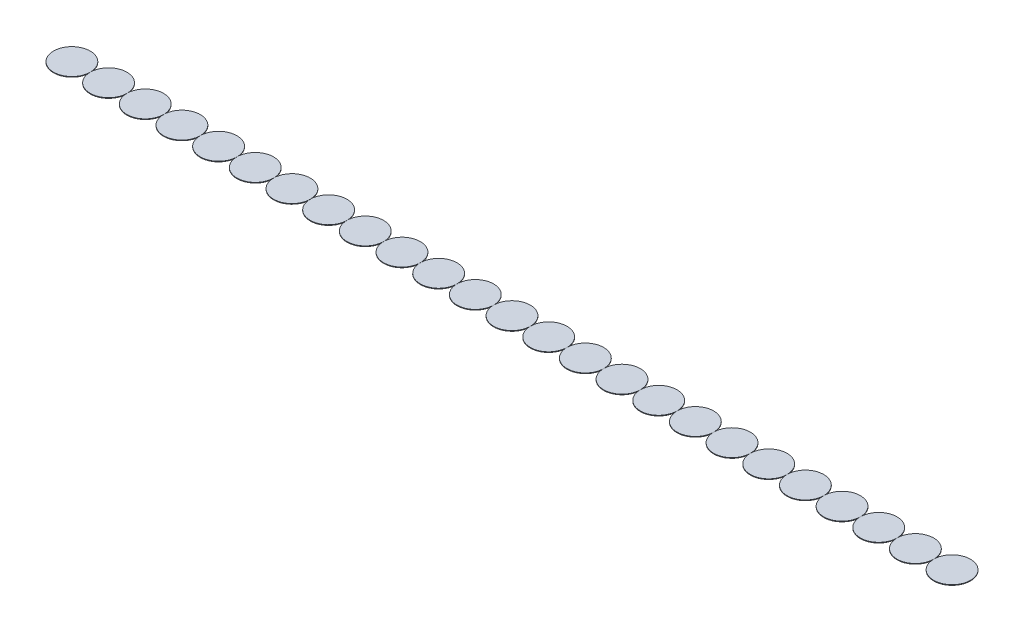
ISO-10303-21;
HEADER;
FILE_DESCRIPTION(('STEP AP214'),'2;1');
FILE_NAME('part.step','',(''),(''),'','','');
FILE_SCHEMA(('AUTOMOTIVE_DESIGN { 1 0 10303 214 1 1 1 1 }'));
ENDSEC;
DATA;
#1=APPLICATION_CONTEXT('core data for automotive mechanical design processes');
#2=APPLICATION_PROTOCOL_DEFINITION('international standard','automotive_design',2000,#1);
#3=PRODUCT_CONTEXT('',#1,'mechanical');
#4=PRODUCT('Part','Part','',(#3));
#5=PRODUCT_RELATED_PRODUCT_CATEGORY('part','',(#4));
#6=PRODUCT_DEFINITION_FORMATION('','',#4);
#7=PRODUCT_DEFINITION_CONTEXT('part definition',#1,'design');
#8=PRODUCT_DEFINITION('design','',#6,#7);
#9=PRODUCT_DEFINITION_SHAPE('','',#8);
#10=(LENGTH_UNIT() NAMED_UNIT(*) SI_UNIT(.MILLI.,.METRE.));
#11=(NAMED_UNIT(*) PLANE_ANGLE_UNIT() SI_UNIT($,.RADIAN.));
#12=(NAMED_UNIT(*) SI_UNIT($,.STERADIAN.) SOLID_ANGLE_UNIT());
#13=UNCERTAINTY_MEASURE_WITH_UNIT(LENGTH_MEASURE(1.E-05),#10,'distance_accuracy_value','');
#14=(GEOMETRIC_REPRESENTATION_CONTEXT(3) GLOBAL_UNCERTAINTY_ASSIGNED_CONTEXT((#13)) GLOBAL_UNIT_ASSIGNED_CONTEXT((#10,
#11,#12)) REPRESENTATION_CONTEXT('',''));
#15=CARTESIAN_POINT('',(0.,0.,0.));
#16=DIRECTION('',(0.,0.,1.));
#17=DIRECTION('',(1.,0.,0.));
#18=AXIS2_PLACEMENT_3D('',#15,#16,#17);
#19=CARTESIAN_POINT('',(1488.,1.,0.));
#20=DIRECTION('',(0.,-1.,0.));
#21=DIRECTION('',(0.,0.,-1.));
#22=AXIS2_PLACEMENT_3D('',#19,#20,#21);
#23=CYLINDRICAL_SURFACE('',#22,30.9999999999999);
#24=CARTESIAN_POINT('',(1488.,1.,0.));
#25=DIRECTION('',(0.,1.,0.));
#26=DIRECTION('',(0.,0.,1.));
#27=AXIS2_PLACEMENT_3D('',#24,#25,#26);
#28=CIRCLE('',#27,30.9999999999999);
#29=CARTESIAN_POINT('',(1488.,1.,30.9999999999999));
#30=VERTEX_POINT('',#29);
#31=EDGE_CURVE('E12',#30,#30,#28,.T.);
#32=ORIENTED_EDGE('',*,*,#31,.F.);
#33=EDGE_LOOP('',(#32));
#34=FACE_BOUND('',#33,.T.);
#35=CARTESIAN_POINT('',(1488.,0.,0.));
#36=DIRECTION('',(0.,1.,0.));
#37=DIRECTION('',(0.,0.,1.));
#38=AXIS2_PLACEMENT_3D('',#35,#36,#37);
#39=CIRCLE('',#38,30.9999999999999);
#40=CARTESIAN_POINT('',(1488.,0.,30.9999999999999));
#41=VERTEX_POINT('',#40);
#42=EDGE_CURVE('E147',#41,#41,#39,.T.);
#43=ORIENTED_EDGE('',*,*,#42,.T.);
#44=EDGE_LOOP('',(#43));
#45=FACE_BOUND('',#44,.T.);
#46=ADVANCED_FACE('F144',(#34,#45),#23,.T.);
#47=CARTESIAN_POINT('',(0.,1.,0.));
#48=DIRECTION('',(0.,1.,0.));
#49=DIRECTION('',(0.,0.,1.));
#50=AXIS2_PLACEMENT_3D('',#47,#48,#49);
#51=PLANE('',#50);
#52=ORIENTED_EDGE('',*,*,#31,.T.);
#53=EDGE_LOOP('',(#52));
#54=FACE_BOUND('',#53,.T.);
#55=ADVANCED_FACE('F159',(#54),#51,.T.);
#56=CARTESIAN_POINT('',(0.,0.,0.));
#57=DIRECTION('',(0.,1.,0.));
#58=DIRECTION('',(0.,0.,1.));
#59=AXIS2_PLACEMENT_3D('',#56,#57,#58);
#60=PLANE('',#59);
#61=ORIENTED_EDGE('',*,*,#42,.F.);
#62=EDGE_LOOP('',(#61));
#63=FACE_BOUND('',#62,.T.);
#64=ADVANCED_FACE('F157',(#63),#60,.F.);
#65=CLOSED_SHELL('',(#46,#55,#64));
#66=MANIFOLD_SOLID_BREP('B2',#65);
#67=CARTESIAN_POINT('',(1426.,1.,0.));
#68=DIRECTION('',(0.,-1.,0.));
#69=DIRECTION('',(0.,0.,-1.));
#70=AXIS2_PLACEMENT_3D('',#67,#68,#69);
#71=CYLINDRICAL_SURFACE('',#70,31.0000000000001);
#72=CARTESIAN_POINT('',(1426.,1.,0.));
#73=DIRECTION('',(0.,1.,0.));
#74=DIRECTION('',(0.,0.,1.));
#75=AXIS2_PLACEMENT_3D('',#72,#73,#74);
#76=CIRCLE('',#75,31.0000000000001);
#77=CARTESIAN_POINT('',(1426.,1.,31.0000000000001));
#78=VERTEX_POINT('',#77);
#79=EDGE_CURVE('E143',#78,#78,#76,.T.);
#80=ORIENTED_EDGE('',*,*,#79,.F.);
#81=EDGE_LOOP('',(#80));
#82=FACE_BOUND('',#81,.T.);
#83=CARTESIAN_POINT('',(1426.,0.,0.));
#84=DIRECTION('',(0.,1.,0.));
#85=DIRECTION('',(0.,0.,1.));
#86=AXIS2_PLACEMENT_3D('',#83,#84,#85);
#87=CIRCLE('',#86,31.0000000000001);
#88=CARTESIAN_POINT('',(1426.,0.,31.0000000000001));
#89=VERTEX_POINT('',#88);
#90=EDGE_CURVE('E196',#89,#89,#87,.T.);
#91=ORIENTED_EDGE('',*,*,#90,.T.);
#92=EDGE_LOOP('',(#91));
#93=FACE_BOUND('',#92,.T.);
#94=ADVANCED_FACE('F193',(#82,#93),#71,.T.);
#95=CARTESIAN_POINT('',(0.,1.,0.));
#96=DIRECTION('',(0.,1.,0.));
#97=DIRECTION('',(0.,0.,1.));
#98=AXIS2_PLACEMENT_3D('',#95,#96,#97);
#99=PLANE('',#98);
#100=ORIENTED_EDGE('',*,*,#79,.T.);
#101=EDGE_LOOP('',(#100));
#102=FACE_BOUND('',#101,.T.);
#103=ADVANCED_FACE('F208',(#102),#99,.T.);
#104=CARTESIAN_POINT('',(0.,0.,0.));
#105=DIRECTION('',(0.,1.,0.));
#106=DIRECTION('',(0.,0.,1.));
#107=AXIS2_PLACEMENT_3D('',#104,#105,#106);
#108=PLANE('',#107);
#109=ORIENTED_EDGE('',*,*,#90,.F.);
#110=EDGE_LOOP('',(#109));
#111=FACE_BOUND('',#110,.T.);
#112=ADVANCED_FACE('F206',(#111),#108,.F.);
#113=CLOSED_SHELL('',(#94,#103,#112));
#114=MANIFOLD_SOLID_BREP('B7',#113);
#115=CARTESIAN_POINT('',(1364.,1.,0.));
#116=DIRECTION('',(0.,-1.,0.));
#117=DIRECTION('',(0.,0.,-1.));
#118=AXIS2_PLACEMENT_3D('',#115,#116,#117);
#119=CYLINDRICAL_SURFACE('',#118,31.0000000000001);
#120=CARTESIAN_POINT('',(1364.,1.,0.));
#121=DIRECTION('',(0.,1.,0.));
#122=DIRECTION('',(0.,0.,1.));
#123=AXIS2_PLACEMENT_3D('',#120,#121,#122);
#124=CIRCLE('',#123,31.0000000000001);
#125=CARTESIAN_POINT('',(1364.,1.,31.0000000000001));
#126=VERTEX_POINT('',#125);
#127=EDGE_CURVE('E192',#126,#126,#124,.T.);
#128=ORIENTED_EDGE('',*,*,#127,.F.);
#129=EDGE_LOOP('',(#128));
#130=FACE_BOUND('',#129,.T.);
#131=CARTESIAN_POINT('',(1364.,0.,0.));
#132=DIRECTION('',(0.,1.,0.));
#133=DIRECTION('',(0.,0.,1.));
#134=AXIS2_PLACEMENT_3D('',#131,#132,#133);
#135=CIRCLE('',#134,31.0000000000001);
#136=CARTESIAN_POINT('',(1364.,0.,31.0000000000001));
#137=VERTEX_POINT('',#136);
#138=EDGE_CURVE('E245',#137,#137,#135,.T.);
#139=ORIENTED_EDGE('',*,*,#138,.T.);
#140=EDGE_LOOP('',(#139));
#141=FACE_BOUND('',#140,.T.);
#142=ADVANCED_FACE('F242',(#130,#141),#119,.T.);
#143=CARTESIAN_POINT('',(0.,1.,0.));
#144=DIRECTION('',(0.,1.,0.));
#145=DIRECTION('',(0.,0.,1.));
#146=AXIS2_PLACEMENT_3D('',#143,#144,#145);
#147=PLANE('',#146);
#148=ORIENTED_EDGE('',*,*,#127,.T.);
#149=EDGE_LOOP('',(#148));
#150=FACE_BOUND('',#149,.T.);
#151=ADVANCED_FACE('F257',(#150),#147,.T.);
#152=CARTESIAN_POINT('',(0.,0.,0.));
#153=DIRECTION('',(0.,1.,0.));
#154=DIRECTION('',(0.,0.,1.));
#155=AXIS2_PLACEMENT_3D('',#152,#153,#154);
#156=PLANE('',#155);
#157=ORIENTED_EDGE('',*,*,#138,.F.);
#158=EDGE_LOOP('',(#157));
#159=FACE_BOUND('',#158,.T.);
#160=ADVANCED_FACE('F255',(#159),#156,.F.);
#161=CLOSED_SHELL('',(#142,#151,#160));
#162=MANIFOLD_SOLID_BREP('B138',#161);
#163=CARTESIAN_POINT('',(1302.,1.,0.));
#164=DIRECTION('',(0.,-1.,0.));
#165=DIRECTION('',(0.,0.,-1.));
#166=AXIS2_PLACEMENT_3D('',#163,#164,#165);
#167=CYLINDRICAL_SURFACE('',#166,30.9999999999999);
#168=CARTESIAN_POINT('',(1302.,1.,0.));
#169=DIRECTION('',(0.,1.,0.));
#170=DIRECTION('',(0.,0.,1.));
#171=AXIS2_PLACEMENT_3D('',#168,#169,#170);
#172=CIRCLE('',#171,30.9999999999999);
#173=CARTESIAN_POINT('',(1302.,1.,30.9999999999999));
#174=VERTEX_POINT('',#173);
#175=EDGE_CURVE('E241',#174,#174,#172,.T.);
#176=ORIENTED_EDGE('',*,*,#175,.F.);
#177=EDGE_LOOP('',(#176));
#178=FACE_BOUND('',#177,.T.);
#179=CARTESIAN_POINT('',(1302.,0.,0.));
#180=DIRECTION('',(0.,1.,0.));
#181=DIRECTION('',(0.,0.,1.));
#182=AXIS2_PLACEMENT_3D('',#179,#180,#181);
#183=CIRCLE('',#182,30.9999999999999);
#184=CARTESIAN_POINT('',(1302.,0.,30.9999999999999));
#185=VERTEX_POINT('',#184);
#186=EDGE_CURVE('E294',#185,#185,#183,.T.);
#187=ORIENTED_EDGE('',*,*,#186,.T.);
#188=EDGE_LOOP('',(#187));
#189=FACE_BOUND('',#188,.T.);
#190=ADVANCED_FACE('F291',(#178,#189),#167,.T.);
#191=CARTESIAN_POINT('',(0.,1.,0.));
#192=DIRECTION('',(0.,1.,0.));
#193=DIRECTION('',(0.,0.,1.));
#194=AXIS2_PLACEMENT_3D('',#191,#192,#193);
#195=PLANE('',#194);
#196=ORIENTED_EDGE('',*,*,#175,.T.);
#197=EDGE_LOOP('',(#196));
#198=FACE_BOUND('',#197,.T.);
#199=ADVANCED_FACE('F306',(#198),#195,.T.);
#200=CARTESIAN_POINT('',(0.,0.,0.));
#201=DIRECTION('',(0.,1.,0.));
#202=DIRECTION('',(0.,0.,1.));
#203=AXIS2_PLACEMENT_3D('',#200,#201,#202);
#204=PLANE('',#203);
#205=ORIENTED_EDGE('',*,*,#186,.F.);
#206=EDGE_LOOP('',(#205));
#207=FACE_BOUND('',#206,.T.);
#208=ADVANCED_FACE('F304',(#207),#204,.F.);
#209=CLOSED_SHELL('',(#190,#199,#208));
#210=MANIFOLD_SOLID_BREP('B187',#209);
#211=CARTESIAN_POINT('',(1240.,1.,0.));
#212=DIRECTION('',(0.,-1.,0.));
#213=DIRECTION('',(0.,0.,-1.));
#214=AXIS2_PLACEMENT_3D('',#211,#212,#213);
#215=CYLINDRICAL_SURFACE('',#214,31.0000000000001);
#216=CARTESIAN_POINT('',(1240.,1.,0.));
#217=DIRECTION('',(0.,1.,0.));
#218=DIRECTION('',(0.,0.,1.));
#219=AXIS2_PLACEMENT_3D('',#216,#217,#218);
#220=CIRCLE('',#219,31.0000000000001);
#221=CARTESIAN_POINT('',(1240.,1.,31.0000000000001));
#222=VERTEX_POINT('',#221);
#223=EDGE_CURVE('E290',#222,#222,#220,.T.);
#224=ORIENTED_EDGE('',*,*,#223,.F.);
#225=EDGE_LOOP('',(#224));
#226=FACE_BOUND('',#225,.T.);
#227=CARTESIAN_POINT('',(1240.,0.,0.));
#228=DIRECTION('',(0.,1.,0.));
#229=DIRECTION('',(0.,0.,1.));
#230=AXIS2_PLACEMENT_3D('',#227,#228,#229);
#231=CIRCLE('',#230,31.0000000000001);
#232=CARTESIAN_POINT('',(1240.,0.,31.0000000000001));
#233=VERTEX_POINT('',#232);
#234=EDGE_CURVE('E343',#233,#233,#231,.T.);
#235=ORIENTED_EDGE('',*,*,#234,.T.);
#236=EDGE_LOOP('',(#235));
#237=FACE_BOUND('',#236,.T.);
#238=ADVANCED_FACE('F340',(#226,#237),#215,.T.);
#239=CARTESIAN_POINT('',(0.,1.,0.));
#240=DIRECTION('',(0.,1.,0.));
#241=DIRECTION('',(0.,0.,1.));
#242=AXIS2_PLACEMENT_3D('',#239,#240,#241);
#243=PLANE('',#242);
#244=ORIENTED_EDGE('',*,*,#223,.T.);
#245=EDGE_LOOP('',(#244));
#246=FACE_BOUND('',#245,.T.);
#247=ADVANCED_FACE('F355',(#246),#243,.T.);
#248=CARTESIAN_POINT('',(0.,0.,0.));
#249=DIRECTION('',(0.,1.,0.));
#250=DIRECTION('',(0.,0.,1.));
#251=AXIS2_PLACEMENT_3D('',#248,#249,#250);
#252=PLANE('',#251);
#253=ORIENTED_EDGE('',*,*,#234,.F.);
#254=EDGE_LOOP('',(#253));
#255=FACE_BOUND('',#254,.T.);
#256=ADVANCED_FACE('F353',(#255),#252,.F.);
#257=CLOSED_SHELL('',(#238,#247,#256));
#258=MANIFOLD_SOLID_BREP('B236',#257);
#259=CARTESIAN_POINT('',(1178.,1.,0.));
#260=DIRECTION('',(0.,-1.,0.));
#261=DIRECTION('',(0.,0.,-1.));
#262=AXIS2_PLACEMENT_3D('',#259,#260,#261);
#263=CYLINDRICAL_SURFACE('',#262,30.9999999999999);
#264=CARTESIAN_POINT('',(1178.,1.,0.));
#265=DIRECTION('',(0.,1.,0.));
#266=DIRECTION('',(0.,0.,1.));
#267=AXIS2_PLACEMENT_3D('',#264,#265,#266);
#268=CIRCLE('',#267,30.9999999999999);
#269=CARTESIAN_POINT('',(1178.,1.,30.9999999999999));
#270=VERTEX_POINT('',#269);
#271=EDGE_CURVE('E339',#270,#270,#268,.T.);
#272=ORIENTED_EDGE('',*,*,#271,.F.);
#273=EDGE_LOOP('',(#272));
#274=FACE_BOUND('',#273,.T.);
#275=CARTESIAN_POINT('',(1178.,0.,0.));
#276=DIRECTION('',(0.,1.,0.));
#277=DIRECTION('',(0.,0.,1.));
#278=AXIS2_PLACEMENT_3D('',#275,#276,#277);
#279=CIRCLE('',#278,30.9999999999999);
#280=CARTESIAN_POINT('',(1178.,0.,30.9999999999999));
#281=VERTEX_POINT('',#280);
#282=EDGE_CURVE('E392',#281,#281,#279,.T.);
#283=ORIENTED_EDGE('',*,*,#282,.T.);
#284=EDGE_LOOP('',(#283));
#285=FACE_BOUND('',#284,.T.);
#286=ADVANCED_FACE('F389',(#274,#285),#263,.T.);
#287=CARTESIAN_POINT('',(0.,1.,0.));
#288=DIRECTION('',(0.,1.,0.));
#289=DIRECTION('',(0.,0.,1.));
#290=AXIS2_PLACEMENT_3D('',#287,#288,#289);
#291=PLANE('',#290);
#292=ORIENTED_EDGE('',*,*,#271,.T.);
#293=EDGE_LOOP('',(#292));
#294=FACE_BOUND('',#293,.T.);
#295=ADVANCED_FACE('F404',(#294),#291,.T.);
#296=CARTESIAN_POINT('',(0.,0.,0.));
#297=DIRECTION('',(0.,1.,0.));
#298=DIRECTION('',(0.,0.,1.));
#299=AXIS2_PLACEMENT_3D('',#296,#297,#298);
#300=PLANE('',#299);
#301=ORIENTED_EDGE('',*,*,#282,.F.);
#302=EDGE_LOOP('',(#301));
#303=FACE_BOUND('',#302,.T.);
#304=ADVANCED_FACE('F402',(#303),#300,.F.);
#305=CLOSED_SHELL('',(#286,#295,#304));
#306=MANIFOLD_SOLID_BREP('B285',#305);
#307=CARTESIAN_POINT('',(1116.,1.,0.));
#308=DIRECTION('',(0.,-1.,0.));
#309=DIRECTION('',(0.,0.,-1.));
#310=AXIS2_PLACEMENT_3D('',#307,#308,#309);
#311=CYLINDRICAL_SURFACE('',#310,31.0000000000001);
#312=CARTESIAN_POINT('',(1116.,1.,0.));
#313=DIRECTION('',(0.,1.,0.));
#314=DIRECTION('',(0.,0.,1.));
#315=AXIS2_PLACEMENT_3D('',#312,#313,#314);
#316=CIRCLE('',#315,31.0000000000001);
#317=CARTESIAN_POINT('',(1116.,1.,31.0000000000001));
#318=VERTEX_POINT('',#317);
#319=EDGE_CURVE('E388',#318,#318,#316,.T.);
#320=ORIENTED_EDGE('',*,*,#319,.F.);
#321=EDGE_LOOP('',(#320));
#322=FACE_BOUND('',#321,.T.);
#323=CARTESIAN_POINT('',(1116.,0.,0.));
#324=DIRECTION('',(0.,1.,0.));
#325=DIRECTION('',(0.,0.,1.));
#326=AXIS2_PLACEMENT_3D('',#323,#324,#325);
#327=CIRCLE('',#326,31.0000000000001);
#328=CARTESIAN_POINT('',(1116.,0.,31.0000000000001));
#329=VERTEX_POINT('',#328);
#330=EDGE_CURVE('E441',#329,#329,#327,.T.);
#331=ORIENTED_EDGE('',*,*,#330,.T.);
#332=EDGE_LOOP('',(#331));
#333=FACE_BOUND('',#332,.T.);
#334=ADVANCED_FACE('F438',(#322,#333),#311,.T.);
#335=CARTESIAN_POINT('',(0.,1.,0.));
#336=DIRECTION('',(0.,1.,0.));
#337=DIRECTION('',(0.,0.,1.));
#338=AXIS2_PLACEMENT_3D('',#335,#336,#337);
#339=PLANE('',#338);
#340=ORIENTED_EDGE('',*,*,#319,.T.);
#341=EDGE_LOOP('',(#340));
#342=FACE_BOUND('',#341,.T.);
#343=ADVANCED_FACE('F453',(#342),#339,.T.);
#344=CARTESIAN_POINT('',(0.,0.,0.));
#345=DIRECTION('',(0.,1.,0.));
#346=DIRECTION('',(0.,0.,1.));
#347=AXIS2_PLACEMENT_3D('',#344,#345,#346);
#348=PLANE('',#347);
#349=ORIENTED_EDGE('',*,*,#330,.F.);
#350=EDGE_LOOP('',(#349));
#351=FACE_BOUND('',#350,.T.);
#352=ADVANCED_FACE('F451',(#351),#348,.F.);
#353=CLOSED_SHELL('',(#334,#343,#352));
#354=MANIFOLD_SOLID_BREP('B334',#353);
#355=CARTESIAN_POINT('',(1054.,1.,0.));
#356=DIRECTION('',(0.,-1.,0.));
#357=DIRECTION('',(0.,0.,-1.));
#358=AXIS2_PLACEMENT_3D('',#355,#356,#357);
#359=CYLINDRICAL_SURFACE('',#358,31.0000000000001);
#360=CARTESIAN_POINT('',(1054.,1.,0.));
#361=DIRECTION('',(0.,1.,0.));
#362=DIRECTION('',(0.,0.,1.));
#363=AXIS2_PLACEMENT_3D('',#360,#361,#362);
#364=CIRCLE('',#363,31.0000000000001);
#365=CARTESIAN_POINT('',(1054.,1.,31.0000000000001));
#366=VERTEX_POINT('',#365);
#367=EDGE_CURVE('E437',#366,#366,#364,.T.);
#368=ORIENTED_EDGE('',*,*,#367,.F.);
#369=EDGE_LOOP('',(#368));
#370=FACE_BOUND('',#369,.T.);
#371=CARTESIAN_POINT('',(1054.,0.,0.));
#372=DIRECTION('',(0.,1.,0.));
#373=DIRECTION('',(0.,0.,1.));
#374=AXIS2_PLACEMENT_3D('',#371,#372,#373);
#375=CIRCLE('',#374,31.0000000000001);
#376=CARTESIAN_POINT('',(1054.,0.,31.0000000000001));
#377=VERTEX_POINT('',#376);
#378=EDGE_CURVE('E490',#377,#377,#375,.T.);
#379=ORIENTED_EDGE('',*,*,#378,.T.);
#380=EDGE_LOOP('',(#379));
#381=FACE_BOUND('',#380,.T.);
#382=ADVANCED_FACE('F487',(#370,#381),#359,.T.);
#383=CARTESIAN_POINT('',(0.,1.,0.));
#384=DIRECTION('',(0.,1.,0.));
#385=DIRECTION('',(0.,0.,1.));
#386=AXIS2_PLACEMENT_3D('',#383,#384,#385);
#387=PLANE('',#386);
#388=ORIENTED_EDGE('',*,*,#367,.T.);
#389=EDGE_LOOP('',(#388));
#390=FACE_BOUND('',#389,.T.);
#391=ADVANCED_FACE('F502',(#390),#387,.T.);
#392=CARTESIAN_POINT('',(0.,0.,0.));
#393=DIRECTION('',(0.,1.,0.));
#394=DIRECTION('',(0.,0.,1.));
#395=AXIS2_PLACEMENT_3D('',#392,#393,#394);
#396=PLANE('',#395);
#397=ORIENTED_EDGE('',*,*,#378,.F.);
#398=EDGE_LOOP('',(#397));
#399=FACE_BOUND('',#398,.T.);
#400=ADVANCED_FACE('F500',(#399),#396,.F.);
#401=CLOSED_SHELL('',(#382,#391,#400));
#402=MANIFOLD_SOLID_BREP('B383',#401);
#403=CARTESIAN_POINT('',(992.,1.,0.));
#404=DIRECTION('',(0.,-1.,0.));
#405=DIRECTION('',(0.,0.,-1.));
#406=AXIS2_PLACEMENT_3D('',#403,#404,#405);
#407=CYLINDRICAL_SURFACE('',#406,30.9999999999999);
#408=CARTESIAN_POINT('',(992.,1.,0.));
#409=DIRECTION('',(0.,1.,0.));
#410=DIRECTION('',(0.,0.,1.));
#411=AXIS2_PLACEMENT_3D('',#408,#409,#410);
#412=CIRCLE('',#411,30.9999999999999);
#413=CARTESIAN_POINT('',(992.,1.,30.9999999999999));
#414=VERTEX_POINT('',#413);
#415=EDGE_CURVE('E486',#414,#414,#412,.T.);
#416=ORIENTED_EDGE('',*,*,#415,.F.);
#417=EDGE_LOOP('',(#416));
#418=FACE_BOUND('',#417,.T.);
#419=CARTESIAN_POINT('',(992.,0.,0.));
#420=DIRECTION('',(0.,1.,0.));
#421=DIRECTION('',(0.,0.,1.));
#422=AXIS2_PLACEMENT_3D('',#419,#420,#421);
#423=CIRCLE('',#422,30.9999999999999);
#424=CARTESIAN_POINT('',(992.,0.,30.9999999999999));
#425=VERTEX_POINT('',#424);
#426=EDGE_CURVE('E539',#425,#425,#423,.T.);
#427=ORIENTED_EDGE('',*,*,#426,.T.);
#428=EDGE_LOOP('',(#427));
#429=FACE_BOUND('',#428,.T.);
#430=ADVANCED_FACE('F536',(#418,#429),#407,.T.);
#431=CARTESIAN_POINT('',(0.,1.,0.));
#432=DIRECTION('',(0.,1.,0.));
#433=DIRECTION('',(0.,0.,1.));
#434=AXIS2_PLACEMENT_3D('',#431,#432,#433);
#435=PLANE('',#434);
#436=ORIENTED_EDGE('',*,*,#415,.T.);
#437=EDGE_LOOP('',(#436));
#438=FACE_BOUND('',#437,.T.);
#439=ADVANCED_FACE('F551',(#438),#435,.T.);
#440=CARTESIAN_POINT('',(0.,0.,0.));
#441=DIRECTION('',(0.,1.,0.));
#442=DIRECTION('',(0.,0.,1.));
#443=AXIS2_PLACEMENT_3D('',#440,#441,#442);
#444=PLANE('',#443);
#445=ORIENTED_EDGE('',*,*,#426,.F.);
#446=EDGE_LOOP('',(#445));
#447=FACE_BOUND('',#446,.T.);
#448=ADVANCED_FACE('F549',(#447),#444,.F.);
#449=CLOSED_SHELL('',(#430,#439,#448));
#450=MANIFOLD_SOLID_BREP('B432',#449);
#451=CARTESIAN_POINT('',(930.,1.,0.));
#452=DIRECTION('',(0.,-1.,0.));
#453=DIRECTION('',(0.,0.,-1.));
#454=AXIS2_PLACEMENT_3D('',#451,#452,#453);
#455=CYLINDRICAL_SURFACE('',#454,31.);
#456=CARTESIAN_POINT('',(930.,1.,0.));
#457=DIRECTION('',(0.,1.,0.));
#458=DIRECTION('',(0.,0.,1.));
#459=AXIS2_PLACEMENT_3D('',#456,#457,#458);
#460=CIRCLE('',#459,31.);
#461=CARTESIAN_POINT('',(930.,1.,31.));
#462=VERTEX_POINT('',#461);
#463=EDGE_CURVE('E535',#462,#462,#460,.T.);
#464=ORIENTED_EDGE('',*,*,#463,.F.);
#465=EDGE_LOOP('',(#464));
#466=FACE_BOUND('',#465,.T.);
#467=CARTESIAN_POINT('',(930.,0.,0.));
#468=DIRECTION('',(0.,1.,0.));
#469=DIRECTION('',(0.,0.,1.));
#470=AXIS2_PLACEMENT_3D('',#467,#468,#469);
#471=CIRCLE('',#470,31.);
#472=CARTESIAN_POINT('',(930.,0.,31.));
#473=VERTEX_POINT('',#472);
#474=EDGE_CURVE('E588',#473,#473,#471,.T.);
#475=ORIENTED_EDGE('',*,*,#474,.T.);
#476=EDGE_LOOP('',(#475));
#477=FACE_BOUND('',#476,.T.);
#478=ADVANCED_FACE('F585',(#466,#477),#455,.T.);
#479=CARTESIAN_POINT('',(0.,1.,0.));
#480=DIRECTION('',(0.,1.,0.));
#481=DIRECTION('',(0.,0.,1.));
#482=AXIS2_PLACEMENT_3D('',#479,#480,#481);
#483=PLANE('',#482);
#484=ORIENTED_EDGE('',*,*,#463,.T.);
#485=EDGE_LOOP('',(#484));
#486=FACE_BOUND('',#485,.T.);
#487=ADVANCED_FACE('F600',(#486),#483,.T.);
#488=CARTESIAN_POINT('',(0.,0.,0.));
#489=DIRECTION('',(0.,1.,0.));
#490=DIRECTION('',(0.,0.,1.));
#491=AXIS2_PLACEMENT_3D('',#488,#489,#490);
#492=PLANE('',#491);
#493=ORIENTED_EDGE('',*,*,#474,.F.);
#494=EDGE_LOOP('',(#493));
#495=FACE_BOUND('',#494,.T.);
#496=ADVANCED_FACE('F598',(#495),#492,.F.);
#497=CLOSED_SHELL('',(#478,#487,#496));
#498=MANIFOLD_SOLID_BREP('B481',#497);
#499=CARTESIAN_POINT('',(868.,1.,0.));
#500=DIRECTION('',(0.,-1.,0.));
#501=DIRECTION('',(0.,0.,-1.));
#502=AXIS2_PLACEMENT_3D('',#499,#500,#501);
#503=CYLINDRICAL_SURFACE('',#502,31.);
#504=CARTESIAN_POINT('',(868.,1.,0.));
#505=DIRECTION('',(0.,1.,0.));
#506=DIRECTION('',(0.,0.,1.));
#507=AXIS2_PLACEMENT_3D('',#504,#505,#506);
#508=CIRCLE('',#507,31.);
#509=CARTESIAN_POINT('',(868.,1.,31.));
#510=VERTEX_POINT('',#509);
#511=EDGE_CURVE('E584',#510,#510,#508,.T.);
#512=ORIENTED_EDGE('',*,*,#511,.F.);
#513=EDGE_LOOP('',(#512));
#514=FACE_BOUND('',#513,.T.);
#515=CARTESIAN_POINT('',(868.,0.,0.));
#516=DIRECTION('',(0.,1.,0.));
#517=DIRECTION('',(0.,0.,1.));
#518=AXIS2_PLACEMENT_3D('',#515,#516,#517);
#519=CIRCLE('',#518,31.);
#520=CARTESIAN_POINT('',(868.,0.,31.));
#521=VERTEX_POINT('',#520);
#522=EDGE_CURVE('E637',#521,#521,#519,.T.);
#523=ORIENTED_EDGE('',*,*,#522,.T.);
#524=EDGE_LOOP('',(#523));
#525=FACE_BOUND('',#524,.T.);
#526=ADVANCED_FACE('F634',(#514,#525),#503,.T.);
#527=CARTESIAN_POINT('',(0.,1.,0.));
#528=DIRECTION('',(0.,1.,0.));
#529=DIRECTION('',(0.,0.,1.));
#530=AXIS2_PLACEMENT_3D('',#527,#528,#529);
#531=PLANE('',#530);
#532=ORIENTED_EDGE('',*,*,#511,.T.);
#533=EDGE_LOOP('',(#532));
#534=FACE_BOUND('',#533,.T.);
#535=ADVANCED_FACE('F649',(#534),#531,.T.);
#536=CARTESIAN_POINT('',(0.,0.,0.));
#537=DIRECTION('',(0.,1.,0.));
#538=DIRECTION('',(0.,0.,1.));
#539=AXIS2_PLACEMENT_3D('',#536,#537,#538);
#540=PLANE('',#539);
#541=ORIENTED_EDGE('',*,*,#522,.F.);
#542=EDGE_LOOP('',(#541));
#543=FACE_BOUND('',#542,.T.);
#544=ADVANCED_FACE('F647',(#543),#540,.F.);
#545=CLOSED_SHELL('',(#526,#535,#544));
#546=MANIFOLD_SOLID_BREP('B530',#545);
#547=CARTESIAN_POINT('',(806.,1.,0.));
#548=DIRECTION('',(0.,-1.,0.));
#549=DIRECTION('',(0.,0.,-1.));
#550=AXIS2_PLACEMENT_3D('',#547,#548,#549);
#551=CYLINDRICAL_SURFACE('',#550,30.9999999999999);
#552=CARTESIAN_POINT('',(806.,1.,0.));
#553=DIRECTION('',(0.,1.,0.));
#554=DIRECTION('',(0.,0.,1.));
#555=AXIS2_PLACEMENT_3D('',#552,#553,#554);
#556=CIRCLE('',#555,30.9999999999999);
#557=CARTESIAN_POINT('',(806.,1.,30.9999999999999));
#558=VERTEX_POINT('',#557);
#559=EDGE_CURVE('E633',#558,#558,#556,.T.);
#560=ORIENTED_EDGE('',*,*,#559,.F.);
#561=EDGE_LOOP('',(#560));
#562=FACE_BOUND('',#561,.T.);
#563=CARTESIAN_POINT('',(806.,0.,0.));
#564=DIRECTION('',(0.,1.,0.));
#565=DIRECTION('',(0.,0.,1.));
#566=AXIS2_PLACEMENT_3D('',#563,#564,#565);
#567=CIRCLE('',#566,30.9999999999999);
#568=CARTESIAN_POINT('',(806.,0.,30.9999999999999));
#569=VERTEX_POINT('',#568);
#570=EDGE_CURVE('E686',#569,#569,#567,.T.);
#571=ORIENTED_EDGE('',*,*,#570,.T.);
#572=EDGE_LOOP('',(#571));
#573=FACE_BOUND('',#572,.T.);
#574=ADVANCED_FACE('F683',(#562,#573),#551,.T.);
#575=CARTESIAN_POINT('',(0.,1.,0.));
#576=DIRECTION('',(0.,1.,0.));
#577=DIRECTION('',(0.,0.,1.));
#578=AXIS2_PLACEMENT_3D('',#575,#576,#577);
#579=PLANE('',#578);
#580=ORIENTED_EDGE('',*,*,#559,.T.);
#581=EDGE_LOOP('',(#580));
#582=FACE_BOUND('',#581,.T.);
#583=ADVANCED_FACE('F698',(#582),#579,.T.);
#584=CARTESIAN_POINT('',(0.,0.,0.));
#585=DIRECTION('',(0.,1.,0.));
#586=DIRECTION('',(0.,0.,1.));
#587=AXIS2_PLACEMENT_3D('',#584,#585,#586);
#588=PLANE('',#587);
#589=ORIENTED_EDGE('',*,*,#570,.F.);
#590=EDGE_LOOP('',(#589));
#591=FACE_BOUND('',#590,.T.);
#592=ADVANCED_FACE('F696',(#591),#588,.F.);
#593=CLOSED_SHELL('',(#574,#583,#592));
#594=MANIFOLD_SOLID_BREP('B579',#593);
#595=CARTESIAN_POINT('',(744.,1.,0.));
#596=DIRECTION('',(0.,-1.,0.));
#597=DIRECTION('',(0.,0.,-1.));
#598=AXIS2_PLACEMENT_3D('',#595,#596,#597);
#599=CYLINDRICAL_SURFACE('',#598,31.);
#600=CARTESIAN_POINT('',(744.,1.,0.));
#601=DIRECTION('',(0.,1.,0.));
#602=DIRECTION('',(0.,0.,1.));
#603=AXIS2_PLACEMENT_3D('',#600,#601,#602);
#604=CIRCLE('',#603,31.);
#605=CARTESIAN_POINT('',(744.,1.,31.));
#606=VERTEX_POINT('',#605);
#607=EDGE_CURVE('E682',#606,#606,#604,.T.);
#608=ORIENTED_EDGE('',*,*,#607,.F.);
#609=EDGE_LOOP('',(#608));
#610=FACE_BOUND('',#609,.T.);
#611=CARTESIAN_POINT('',(744.,0.,0.));
#612=DIRECTION('',(0.,1.,0.));
#613=DIRECTION('',(0.,0.,1.));
#614=AXIS2_PLACEMENT_3D('',#611,#612,#613);
#615=CIRCLE('',#614,31.);
#616=CARTESIAN_POINT('',(744.,0.,31.));
#617=VERTEX_POINT('',#616);
#618=EDGE_CURVE('E735',#617,#617,#615,.T.);
#619=ORIENTED_EDGE('',*,*,#618,.T.);
#620=EDGE_LOOP('',(#619));
#621=FACE_BOUND('',#620,.T.);
#622=ADVANCED_FACE('F732',(#610,#621),#599,.T.);
#623=CARTESIAN_POINT('',(0.,1.,0.));
#624=DIRECTION('',(0.,1.,0.));
#625=DIRECTION('',(0.,0.,1.));
#626=AXIS2_PLACEMENT_3D('',#623,#624,#625);
#627=PLANE('',#626);
#628=ORIENTED_EDGE('',*,*,#607,.T.);
#629=EDGE_LOOP('',(#628));
#630=FACE_BOUND('',#629,.T.);
#631=ADVANCED_FACE('F747',(#630),#627,.T.);
#632=CARTESIAN_POINT('',(0.,0.,0.));
#633=DIRECTION('',(0.,1.,0.));
#634=DIRECTION('',(0.,0.,1.));
#635=AXIS2_PLACEMENT_3D('',#632,#633,#634);
#636=PLANE('',#635);
#637=ORIENTED_EDGE('',*,*,#618,.F.);
#638=EDGE_LOOP('',(#637));
#639=FACE_BOUND('',#638,.T.);
#640=ADVANCED_FACE('F745',(#639),#636,.F.);
#641=CLOSED_SHELL('',(#622,#631,#640));
#642=MANIFOLD_SOLID_BREP('B628',#641);
#643=CARTESIAN_POINT('',(682.,1.,0.));
#644=DIRECTION('',(0.,-1.,0.));
#645=DIRECTION('',(0.,0.,-1.));
#646=AXIS2_PLACEMENT_3D('',#643,#644,#645);
#647=CYLINDRICAL_SURFACE('',#646,31.0000000000001);
#648=CARTESIAN_POINT('',(682.,1.,0.));
#649=DIRECTION('',(0.,1.,0.));
#650=DIRECTION('',(0.,0.,1.));
#651=AXIS2_PLACEMENT_3D('',#648,#649,#650);
#652=CIRCLE('',#651,31.0000000000001);
#653=CARTESIAN_POINT('',(682.,1.,31.0000000000001));
#654=VERTEX_POINT('',#653);
#655=EDGE_CURVE('E731',#654,#654,#652,.T.);
#656=ORIENTED_EDGE('',*,*,#655,.F.);
#657=EDGE_LOOP('',(#656));
#658=FACE_BOUND('',#657,.T.);
#659=CARTESIAN_POINT('',(682.,0.,0.));
#660=DIRECTION('',(0.,1.,0.));
#661=DIRECTION('',(0.,0.,1.));
#662=AXIS2_PLACEMENT_3D('',#659,#660,#661);
#663=CIRCLE('',#662,31.0000000000001);
#664=CARTESIAN_POINT('',(682.,0.,31.0000000000001));
#665=VERTEX_POINT('',#664);
#666=EDGE_CURVE('E784',#665,#665,#663,.T.);
#667=ORIENTED_EDGE('',*,*,#666,.T.);
#668=EDGE_LOOP('',(#667));
#669=FACE_BOUND('',#668,.T.);
#670=ADVANCED_FACE('F781',(#658,#669),#647,.T.);
#671=CARTESIAN_POINT('',(0.,1.,0.));
#672=DIRECTION('',(0.,1.,0.));
#673=DIRECTION('',(0.,0.,1.));
#674=AXIS2_PLACEMENT_3D('',#671,#672,#673);
#675=PLANE('',#674);
#676=ORIENTED_EDGE('',*,*,#655,.T.);
#677=EDGE_LOOP('',(#676));
#678=FACE_BOUND('',#677,.T.);
#679=ADVANCED_FACE('F796',(#678),#675,.T.);
#680=CARTESIAN_POINT('',(0.,0.,0.));
#681=DIRECTION('',(0.,1.,0.));
#682=DIRECTION('',(0.,0.,1.));
#683=AXIS2_PLACEMENT_3D('',#680,#681,#682);
#684=PLANE('',#683);
#685=ORIENTED_EDGE('',*,*,#666,.F.);
#686=EDGE_LOOP('',(#685));
#687=FACE_BOUND('',#686,.T.);
#688=ADVANCED_FACE('F794',(#687),#684,.F.);
#689=CLOSED_SHELL('',(#670,#679,#688));
#690=MANIFOLD_SOLID_BREP('B677',#689);
#691=CARTESIAN_POINT('',(620.,1.,0.));
#692=DIRECTION('',(0.,-1.,0.));
#693=DIRECTION('',(0.,0.,-1.));
#694=AXIS2_PLACEMENT_3D('',#691,#692,#693);
#695=CYLINDRICAL_SURFACE('',#694,31.);
#696=CARTESIAN_POINT('',(620.,1.,0.));
#697=DIRECTION('',(0.,1.,0.));
#698=DIRECTION('',(0.,0.,1.));
#699=AXIS2_PLACEMENT_3D('',#696,#697,#698);
#700=CIRCLE('',#699,31.);
#701=CARTESIAN_POINT('',(620.,1.,31.));
#702=VERTEX_POINT('',#701);
#703=EDGE_CURVE('E780',#702,#702,#700,.T.);
#704=ORIENTED_EDGE('',*,*,#703,.F.);
#705=EDGE_LOOP('',(#704));
#706=FACE_BOUND('',#705,.T.);
#707=CARTESIAN_POINT('',(620.,0.,0.));
#708=DIRECTION('',(0.,1.,0.));
#709=DIRECTION('',(0.,0.,1.));
#710=AXIS2_PLACEMENT_3D('',#707,#708,#709);
#711=CIRCLE('',#710,31.);
#712=CARTESIAN_POINT('',(620.,0.,31.));
#713=VERTEX_POINT('',#712);
#714=EDGE_CURVE('E833',#713,#713,#711,.T.);
#715=ORIENTED_EDGE('',*,*,#714,.T.);
#716=EDGE_LOOP('',(#715));
#717=FACE_BOUND('',#716,.T.);
#718=ADVANCED_FACE('F830',(#706,#717),#695,.T.);
#719=CARTESIAN_POINT('',(0.,1.,0.));
#720=DIRECTION('',(0.,1.,0.));
#721=DIRECTION('',(0.,0.,1.));
#722=AXIS2_PLACEMENT_3D('',#719,#720,#721);
#723=PLANE('',#722);
#724=ORIENTED_EDGE('',*,*,#703,.T.);
#725=EDGE_LOOP('',(#724));
#726=FACE_BOUND('',#725,.T.);
#727=ADVANCED_FACE('F845',(#726),#723,.T.);
#728=CARTESIAN_POINT('',(0.,0.,0.));
#729=DIRECTION('',(0.,1.,0.));
#730=DIRECTION('',(0.,0.,1.));
#731=AXIS2_PLACEMENT_3D('',#728,#729,#730);
#732=PLANE('',#731);
#733=ORIENTED_EDGE('',*,*,#714,.F.);
#734=EDGE_LOOP('',(#733));
#735=FACE_BOUND('',#734,.T.);
#736=ADVANCED_FACE('F843',(#735),#732,.F.);
#737=CLOSED_SHELL('',(#718,#727,#736));
#738=MANIFOLD_SOLID_BREP('B726',#737);
#739=CARTESIAN_POINT('',(558.,1.,0.));
#740=DIRECTION('',(0.,-1.,0.));
#741=DIRECTION('',(0.,0.,-1.));
#742=AXIS2_PLACEMENT_3D('',#739,#740,#741);
#743=CYLINDRICAL_SURFACE('',#742,30.9999999999999);
#744=CARTESIAN_POINT('',(558.,1.,0.));
#745=DIRECTION('',(0.,1.,0.));
#746=DIRECTION('',(0.,0.,1.));
#747=AXIS2_PLACEMENT_3D('',#744,#745,#746);
#748=CIRCLE('',#747,30.9999999999999);
#749=CARTESIAN_POINT('',(558.,1.,30.9999999999999));
#750=VERTEX_POINT('',#749);
#751=EDGE_CURVE('E829',#750,#750,#748,.T.);
#752=ORIENTED_EDGE('',*,*,#751,.F.);
#753=EDGE_LOOP('',(#752));
#754=FACE_BOUND('',#753,.T.);
#755=CARTESIAN_POINT('',(558.,0.,0.));
#756=DIRECTION('',(0.,1.,0.));
#757=DIRECTION('',(0.,0.,1.));
#758=AXIS2_PLACEMENT_3D('',#755,#756,#757);
#759=CIRCLE('',#758,30.9999999999999);
#760=CARTESIAN_POINT('',(558.,0.,30.9999999999999));
#761=VERTEX_POINT('',#760);
#762=EDGE_CURVE('E882',#761,#761,#759,.T.);
#763=ORIENTED_EDGE('',*,*,#762,.T.);
#764=EDGE_LOOP('',(#763));
#765=FACE_BOUND('',#764,.T.);
#766=ADVANCED_FACE('F879',(#754,#765),#743,.T.);
#767=CARTESIAN_POINT('',(0.,1.,0.));
#768=DIRECTION('',(0.,1.,0.));
#769=DIRECTION('',(0.,0.,1.));
#770=AXIS2_PLACEMENT_3D('',#767,#768,#769);
#771=PLANE('',#770);
#772=ORIENTED_EDGE('',*,*,#751,.T.);
#773=EDGE_LOOP('',(#772));
#774=FACE_BOUND('',#773,.T.);
#775=ADVANCED_FACE('F894',(#774),#771,.T.);
#776=CARTESIAN_POINT('',(0.,0.,0.));
#777=DIRECTION('',(0.,1.,0.));
#778=DIRECTION('',(0.,0.,1.));
#779=AXIS2_PLACEMENT_3D('',#776,#777,#778);
#780=PLANE('',#779);
#781=ORIENTED_EDGE('',*,*,#762,.F.);
#782=EDGE_LOOP('',(#781));
#783=FACE_BOUND('',#782,.T.);
#784=ADVANCED_FACE('F892',(#783),#780,.F.);
#785=CLOSED_SHELL('',(#766,#775,#784));
#786=MANIFOLD_SOLID_BREP('B775',#785);
#787=CARTESIAN_POINT('',(496.,1.,0.));
#788=DIRECTION('',(0.,-1.,0.));
#789=DIRECTION('',(0.,0.,-1.));
#790=AXIS2_PLACEMENT_3D('',#787,#788,#789);
#791=CYLINDRICAL_SURFACE('',#790,31.);
#792=CARTESIAN_POINT('',(496.,1.,0.));
#793=DIRECTION('',(0.,1.,0.));
#794=DIRECTION('',(0.,0.,1.));
#795=AXIS2_PLACEMENT_3D('',#792,#793,#794);
#796=CIRCLE('',#795,31.);
#797=CARTESIAN_POINT('',(496.,1.,31.));
#798=VERTEX_POINT('',#797);
#799=EDGE_CURVE('E878',#798,#798,#796,.T.);
#800=ORIENTED_EDGE('',*,*,#799,.F.);
#801=EDGE_LOOP('',(#800));
#802=FACE_BOUND('',#801,.T.);
#803=CARTESIAN_POINT('',(496.,0.,0.));
#804=DIRECTION('',(0.,1.,0.));
#805=DIRECTION('',(0.,0.,1.));
#806=AXIS2_PLACEMENT_3D('',#803,#804,#805);
#807=CIRCLE('',#806,31.);
#808=CARTESIAN_POINT('',(496.,0.,31.));
#809=VERTEX_POINT('',#808);
#810=EDGE_CURVE('E931',#809,#809,#807,.T.);
#811=ORIENTED_EDGE('',*,*,#810,.T.);
#812=EDGE_LOOP('',(#811));
#813=FACE_BOUND('',#812,.T.);
#814=ADVANCED_FACE('F928',(#802,#813),#791,.T.);
#815=CARTESIAN_POINT('',(0.,1.,0.));
#816=DIRECTION('',(0.,1.,0.));
#817=DIRECTION('',(0.,0.,1.));
#818=AXIS2_PLACEMENT_3D('',#815,#816,#817);
#819=PLANE('',#818);
#820=ORIENTED_EDGE('',*,*,#799,.T.);
#821=EDGE_LOOP('',(#820));
#822=FACE_BOUND('',#821,.T.);
#823=ADVANCED_FACE('F943',(#822),#819,.T.);
#824=CARTESIAN_POINT('',(0.,0.,0.));
#825=DIRECTION('',(0.,1.,0.));
#826=DIRECTION('',(0.,0.,1.));
#827=AXIS2_PLACEMENT_3D('',#824,#825,#826);
#828=PLANE('',#827);
#829=ORIENTED_EDGE('',*,*,#810,.F.);
#830=EDGE_LOOP('',(#829));
#831=FACE_BOUND('',#830,.T.);
#832=ADVANCED_FACE('F941',(#831),#828,.F.);
#833=CLOSED_SHELL('',(#814,#823,#832));
#834=MANIFOLD_SOLID_BREP('B824',#833);
#835=CARTESIAN_POINT('',(434.,1.,0.));
#836=DIRECTION('',(0.,-1.,0.));
#837=DIRECTION('',(0.,0.,-1.));
#838=AXIS2_PLACEMENT_3D('',#835,#836,#837);
#839=CYLINDRICAL_SURFACE('',#838,31.);
#840=CARTESIAN_POINT('',(434.,1.,0.));
#841=DIRECTION('',(0.,1.,0.));
#842=DIRECTION('',(0.,0.,1.));
#843=AXIS2_PLACEMENT_3D('',#840,#841,#842);
#844=CIRCLE('',#843,31.);
#845=CARTESIAN_POINT('',(434.,1.,31.));
#846=VERTEX_POINT('',#845);
#847=EDGE_CURVE('E927',#846,#846,#844,.T.);
#848=ORIENTED_EDGE('',*,*,#847,.F.);
#849=EDGE_LOOP('',(#848));
#850=FACE_BOUND('',#849,.T.);
#851=CARTESIAN_POINT('',(434.,0.,0.));
#852=DIRECTION('',(0.,1.,0.));
#853=DIRECTION('',(0.,0.,1.));
#854=AXIS2_PLACEMENT_3D('',#851,#852,#853);
#855=CIRCLE('',#854,31.);
#856=CARTESIAN_POINT('',(434.,0.,31.));
#857=VERTEX_POINT('',#856);
#858=EDGE_CURVE('E980',#857,#857,#855,.T.);
#859=ORIENTED_EDGE('',*,*,#858,.T.);
#860=EDGE_LOOP('',(#859));
#861=FACE_BOUND('',#860,.T.);
#862=ADVANCED_FACE('F977',(#850,#861),#839,.T.);
#863=CARTESIAN_POINT('',(0.,1.,0.));
#864=DIRECTION('',(0.,1.,0.));
#865=DIRECTION('',(0.,0.,1.));
#866=AXIS2_PLACEMENT_3D('',#863,#864,#865);
#867=PLANE('',#866);
#868=ORIENTED_EDGE('',*,*,#847,.T.);
#869=EDGE_LOOP('',(#868));
#870=FACE_BOUND('',#869,.T.);
#871=ADVANCED_FACE('F992',(#870),#867,.T.);
#872=CARTESIAN_POINT('',(0.,0.,0.));
#873=DIRECTION('',(0.,1.,0.));
#874=DIRECTION('',(0.,0.,1.));
#875=AXIS2_PLACEMENT_3D('',#872,#873,#874);
#876=PLANE('',#875);
#877=ORIENTED_EDGE('',*,*,#858,.F.);
#878=EDGE_LOOP('',(#877));
#879=FACE_BOUND('',#878,.T.);
#880=ADVANCED_FACE('F990',(#879),#876,.F.);
#881=CLOSED_SHELL('',(#862,#871,#880));
#882=MANIFOLD_SOLID_BREP('B873',#881);
#883=CARTESIAN_POINT('',(372.,1.,0.));
#884=DIRECTION('',(0.,-1.,0.));
#885=DIRECTION('',(0.,0.,-1.));
#886=AXIS2_PLACEMENT_3D('',#883,#884,#885);
#887=CYLINDRICAL_SURFACE('',#886,31.);
#888=CARTESIAN_POINT('',(372.,1.,0.));
#889=DIRECTION('',(0.,1.,0.));
#890=DIRECTION('',(0.,0.,1.));
#891=AXIS2_PLACEMENT_3D('',#888,#889,#890);
#892=CIRCLE('',#891,31.);
#893=CARTESIAN_POINT('',(372.,1.,31.));
#894=VERTEX_POINT('',#893);
#895=EDGE_CURVE('E976',#894,#894,#892,.T.);
#896=ORIENTED_EDGE('',*,*,#895,.F.);
#897=EDGE_LOOP('',(#896));
#898=FACE_BOUND('',#897,.T.);
#899=CARTESIAN_POINT('',(372.,0.,0.));
#900=DIRECTION('',(0.,1.,0.));
#901=DIRECTION('',(0.,0.,1.));
#902=AXIS2_PLACEMENT_3D('',#899,#900,#901);
#903=CIRCLE('',#902,31.);
#904=CARTESIAN_POINT('',(372.,0.,31.));
#905=VERTEX_POINT('',#904);
#906=EDGE_CURVE('E1029',#905,#905,#903,.T.);
#907=ORIENTED_EDGE('',*,*,#906,.T.);
#908=EDGE_LOOP('',(#907));
#909=FACE_BOUND('',#908,.T.);
#910=ADVANCED_FACE('F1026',(#898,#909),#887,.T.);
#911=CARTESIAN_POINT('',(0.,1.,0.));
#912=DIRECTION('',(0.,1.,0.));
#913=DIRECTION('',(0.,0.,1.));
#914=AXIS2_PLACEMENT_3D('',#911,#912,#913);
#915=PLANE('',#914);
#916=ORIENTED_EDGE('',*,*,#895,.T.);
#917=EDGE_LOOP('',(#916));
#918=FACE_BOUND('',#917,.T.);
#919=ADVANCED_FACE('F1041',(#918),#915,.T.);
#920=CARTESIAN_POINT('',(0.,0.,0.));
#921=DIRECTION('',(0.,1.,0.));
#922=DIRECTION('',(0.,0.,1.));
#923=AXIS2_PLACEMENT_3D('',#920,#921,#922);
#924=PLANE('',#923);
#925=ORIENTED_EDGE('',*,*,#906,.F.);
#926=EDGE_LOOP('',(#925));
#927=FACE_BOUND('',#926,.T.);
#928=ADVANCED_FACE('F1039',(#927),#924,.F.);
#929=CLOSED_SHELL('',(#910,#919,#928));
#930=MANIFOLD_SOLID_BREP('B922',#929);
#931=CARTESIAN_POINT('',(310.,1.,0.));
#932=DIRECTION('',(0.,-1.,0.));
#933=DIRECTION('',(0.,0.,-1.));
#934=AXIS2_PLACEMENT_3D('',#931,#932,#933);
#935=CYLINDRICAL_SURFACE('',#934,31.);
#936=CARTESIAN_POINT('',(310.,1.,0.));
#937=DIRECTION('',(0.,1.,0.));
#938=DIRECTION('',(0.,0.,1.));
#939=AXIS2_PLACEMENT_3D('',#936,#937,#938);
#940=CIRCLE('',#939,31.);
#941=CARTESIAN_POINT('',(310.,1.,31.));
#942=VERTEX_POINT('',#941);
#943=EDGE_CURVE('E1025',#942,#942,#940,.T.);
#944=ORIENTED_EDGE('',*,*,#943,.F.);
#945=EDGE_LOOP('',(#944));
#946=FACE_BOUND('',#945,.T.);
#947=CARTESIAN_POINT('',(310.,0.,0.));
#948=DIRECTION('',(0.,1.,0.));
#949=DIRECTION('',(0.,0.,1.));
#950=AXIS2_PLACEMENT_3D('',#947,#948,#949);
#951=CIRCLE('',#950,31.);
#952=CARTESIAN_POINT('',(310.,0.,31.));
#953=VERTEX_POINT('',#952);
#954=EDGE_CURVE('E1078',#953,#953,#951,.T.);
#955=ORIENTED_EDGE('',*,*,#954,.T.);
#956=EDGE_LOOP('',(#955));
#957=FACE_BOUND('',#956,.T.);
#958=ADVANCED_FACE('F1075',(#946,#957),#935,.T.);
#959=CARTESIAN_POINT('',(0.,1.,0.));
#960=DIRECTION('',(0.,1.,0.));
#961=DIRECTION('',(0.,0.,1.));
#962=AXIS2_PLACEMENT_3D('',#959,#960,#961);
#963=PLANE('',#962);
#964=ORIENTED_EDGE('',*,*,#943,.T.);
#965=EDGE_LOOP('',(#964));
#966=FACE_BOUND('',#965,.T.);
#967=ADVANCED_FACE('F1090',(#966),#963,.T.);
#968=CARTESIAN_POINT('',(0.,0.,0.));
#969=DIRECTION('',(0.,1.,0.));
#970=DIRECTION('',(0.,0.,1.));
#971=AXIS2_PLACEMENT_3D('',#968,#969,#970);
#972=PLANE('',#971);
#973=ORIENTED_EDGE('',*,*,#954,.F.);
#974=EDGE_LOOP('',(#973));
#975=FACE_BOUND('',#974,.T.);
#976=ADVANCED_FACE('F1088',(#975),#972,.F.);
#977=CLOSED_SHELL('',(#958,#967,#976));
#978=MANIFOLD_SOLID_BREP('B971',#977);
#979=CARTESIAN_POINT('',(248.,1.,0.));
#980=DIRECTION('',(0.,-1.,0.));
#981=DIRECTION('',(0.,0.,-1.));
#982=AXIS2_PLACEMENT_3D('',#979,#980,#981);
#983=CYLINDRICAL_SURFACE('',#982,31.);
#984=CARTESIAN_POINT('',(248.,1.,0.));
#985=DIRECTION('',(0.,1.,0.));
#986=DIRECTION('',(0.,0.,1.));
#987=AXIS2_PLACEMENT_3D('',#984,#985,#986);
#988=CIRCLE('',#987,31.);
#989=CARTESIAN_POINT('',(248.,1.,31.));
#990=VERTEX_POINT('',#989);
#991=EDGE_CURVE('E1074',#990,#990,#988,.T.);
#992=ORIENTED_EDGE('',*,*,#991,.F.);
#993=EDGE_LOOP('',(#992));
#994=FACE_BOUND('',#993,.T.);
#995=CARTESIAN_POINT('',(248.,0.,0.));
#996=DIRECTION('',(0.,1.,0.));
#997=DIRECTION('',(0.,0.,1.));
#998=AXIS2_PLACEMENT_3D('',#995,#996,#997);
#999=CIRCLE('',#998,31.);
#1000=CARTESIAN_POINT('',(248.,0.,31.));
#1001=VERTEX_POINT('',#1000);
#1002=EDGE_CURVE('E1127',#1001,#1001,#999,.T.);
#1003=ORIENTED_EDGE('',*,*,#1002,.T.);
#1004=EDGE_LOOP('',(#1003));
#1005=FACE_BOUND('',#1004,.T.);
#1006=ADVANCED_FACE('F1124',(#994,#1005),#983,.T.);
#1007=CARTESIAN_POINT('',(0.,1.,0.));
#1008=DIRECTION('',(0.,1.,0.));
#1009=DIRECTION('',(0.,0.,1.));
#1010=AXIS2_PLACEMENT_3D('',#1007,#1008,#1009);
#1011=PLANE('',#1010);
#1012=ORIENTED_EDGE('',*,*,#991,.T.);
#1013=EDGE_LOOP('',(#1012));
#1014=FACE_BOUND('',#1013,.T.);
#1015=ADVANCED_FACE('F1139',(#1014),#1011,.T.);
#1016=CARTESIAN_POINT('',(0.,0.,0.));
#1017=DIRECTION('',(0.,1.,0.));
#1018=DIRECTION('',(0.,0.,1.));
#1019=AXIS2_PLACEMENT_3D('',#1016,#1017,#1018);
#1020=PLANE('',#1019);
#1021=ORIENTED_EDGE('',*,*,#1002,.F.);
#1022=EDGE_LOOP('',(#1021));
#1023=FACE_BOUND('',#1022,.T.);
#1024=ADVANCED_FACE('F1137',(#1023),#1020,.F.);
#1025=CLOSED_SHELL('',(#1006,#1015,#1024));
#1026=MANIFOLD_SOLID_BREP('B1020',#1025);
#1027=CARTESIAN_POINT('',(186.,1.,0.));
#1028=DIRECTION('',(0.,-1.,0.));
#1029=DIRECTION('',(0.,0.,-1.));
#1030=AXIS2_PLACEMENT_3D('',#1027,#1028,#1029);
#1031=CYLINDRICAL_SURFACE('',#1030,31.);
#1032=CARTESIAN_POINT('',(186.,1.,0.));
#1033=DIRECTION('',(0.,1.,0.));
#1034=DIRECTION('',(0.,0.,1.));
#1035=AXIS2_PLACEMENT_3D('',#1032,#1033,#1034);
#1036=CIRCLE('',#1035,31.);
#1037=CARTESIAN_POINT('',(186.,1.,31.));
#1038=VERTEX_POINT('',#1037);
#1039=EDGE_CURVE('E1123',#1038,#1038,#1036,.T.);
#1040=ORIENTED_EDGE('',*,*,#1039,.F.);
#1041=EDGE_LOOP('',(#1040));
#1042=FACE_BOUND('',#1041,.T.);
#1043=CARTESIAN_POINT('',(186.,0.,0.));
#1044=DIRECTION('',(0.,1.,0.));
#1045=DIRECTION('',(0.,0.,1.));
#1046=AXIS2_PLACEMENT_3D('',#1043,#1044,#1045);
#1047=CIRCLE('',#1046,31.);
#1048=CARTESIAN_POINT('',(186.,0.,31.));
#1049=VERTEX_POINT('',#1048);
#1050=EDGE_CURVE('E1176',#1049,#1049,#1047,.T.);
#1051=ORIENTED_EDGE('',*,*,#1050,.T.);
#1052=EDGE_LOOP('',(#1051));
#1053=FACE_BOUND('',#1052,.T.);
#1054=ADVANCED_FACE('F1173',(#1042,#1053),#1031,.T.);
#1055=CARTESIAN_POINT('',(0.,1.,0.));
#1056=DIRECTION('',(0.,1.,0.));
#1057=DIRECTION('',(0.,0.,1.));
#1058=AXIS2_PLACEMENT_3D('',#1055,#1056,#1057);
#1059=PLANE('',#1058);
#1060=ORIENTED_EDGE('',*,*,#1039,.T.);
#1061=EDGE_LOOP('',(#1060));
#1062=FACE_BOUND('',#1061,.T.);
#1063=ADVANCED_FACE('F1188',(#1062),#1059,.T.);
#1064=CARTESIAN_POINT('',(0.,0.,0.));
#1065=DIRECTION('',(0.,1.,0.));
#1066=DIRECTION('',(0.,0.,1.));
#1067=AXIS2_PLACEMENT_3D('',#1064,#1065,#1066);
#1068=PLANE('',#1067);
#1069=ORIENTED_EDGE('',*,*,#1050,.F.);
#1070=EDGE_LOOP('',(#1069));
#1071=FACE_BOUND('',#1070,.T.);
#1072=ADVANCED_FACE('F1186',(#1071),#1068,.F.);
#1073=CLOSED_SHELL('',(#1054,#1063,#1072));
#1074=MANIFOLD_SOLID_BREP('B1069',#1073);
#1075=CARTESIAN_POINT('',(124.,1.,0.));
#1076=DIRECTION('',(0.,-1.,0.));
#1077=DIRECTION('',(0.,0.,-1.));
#1078=AXIS2_PLACEMENT_3D('',#1075,#1076,#1077);
#1079=CYLINDRICAL_SURFACE('',#1078,31.);
#1080=CARTESIAN_POINT('',(124.,1.,0.));
#1081=DIRECTION('',(0.,1.,0.));
#1082=DIRECTION('',(0.,0.,1.));
#1083=AXIS2_PLACEMENT_3D('',#1080,#1081,#1082);
#1084=CIRCLE('',#1083,31.);
#1085=CARTESIAN_POINT('',(124.,1.,31.));
#1086=VERTEX_POINT('',#1085);
#1087=EDGE_CURVE('E1172',#1086,#1086,#1084,.T.);
#1088=ORIENTED_EDGE('',*,*,#1087,.F.);
#1089=EDGE_LOOP('',(#1088));
#1090=FACE_BOUND('',#1089,.T.);
#1091=CARTESIAN_POINT('',(124.,0.,0.));
#1092=DIRECTION('',(0.,1.,0.));
#1093=DIRECTION('',(0.,0.,1.));
#1094=AXIS2_PLACEMENT_3D('',#1091,#1092,#1093);
#1095=CIRCLE('',#1094,31.);
#1096=CARTESIAN_POINT('',(124.,0.,31.));
#1097=VERTEX_POINT('',#1096);
#1098=EDGE_CURVE('E1225',#1097,#1097,#1095,.T.);
#1099=ORIENTED_EDGE('',*,*,#1098,.T.);
#1100=EDGE_LOOP('',(#1099));
#1101=FACE_BOUND('',#1100,.T.);
#1102=ADVANCED_FACE('F1222',(#1090,#1101),#1079,.T.);
#1103=CARTESIAN_POINT('',(0.,1.,0.));
#1104=DIRECTION('',(0.,1.,0.));
#1105=DIRECTION('',(0.,0.,1.));
#1106=AXIS2_PLACEMENT_3D('',#1103,#1104,#1105);
#1107=PLANE('',#1106);
#1108=ORIENTED_EDGE('',*,*,#1087,.T.);
#1109=EDGE_LOOP('',(#1108));
#1110=FACE_BOUND('',#1109,.T.);
#1111=ADVANCED_FACE('F1237',(#1110),#1107,.T.);
#1112=CARTESIAN_POINT('',(0.,0.,0.));
#1113=DIRECTION('',(0.,1.,0.));
#1114=DIRECTION('',(0.,0.,1.));
#1115=AXIS2_PLACEMENT_3D('',#1112,#1113,#1114);
#1116=PLANE('',#1115);
#1117=ORIENTED_EDGE('',*,*,#1098,.F.);
#1118=EDGE_LOOP('',(#1117));
#1119=FACE_BOUND('',#1118,.T.);
#1120=ADVANCED_FACE('F1235',(#1119),#1116,.F.);
#1121=CLOSED_SHELL('',(#1102,#1111,#1120));
#1122=MANIFOLD_SOLID_BREP('B1118',#1121);
#1123=CARTESIAN_POINT('',(62.,1.,0.));
#1124=DIRECTION('',(0.,-1.,0.));
#1125=DIRECTION('',(0.,0.,-1.));
#1126=AXIS2_PLACEMENT_3D('',#1123,#1124,#1125);
#1127=CYLINDRICAL_SURFACE('',#1126,31.);
#1128=CARTESIAN_POINT('',(62.,1.,0.));
#1129=DIRECTION('',(0.,1.,0.));
#1130=DIRECTION('',(0.,0.,1.));
#1131=AXIS2_PLACEMENT_3D('',#1128,#1129,#1130);
#1132=CIRCLE('',#1131,31.);
#1133=CARTESIAN_POINT('',(62.,1.,31.));
#1134=VERTEX_POINT('',#1133);
#1135=EDGE_CURVE('E1221',#1134,#1134,#1132,.T.);
#1136=ORIENTED_EDGE('',*,*,#1135,.F.);
#1137=EDGE_LOOP('',(#1136));
#1138=FACE_BOUND('',#1137,.T.);
#1139=CARTESIAN_POINT('',(62.,0.,0.));
#1140=DIRECTION('',(0.,1.,0.));
#1141=DIRECTION('',(0.,0.,1.));
#1142=AXIS2_PLACEMENT_3D('',#1139,#1140,#1141);
#1143=CIRCLE('',#1142,31.);
#1144=CARTESIAN_POINT('',(62.,0.,31.));
#1145=VERTEX_POINT('',#1144);
#1146=EDGE_CURVE('E1273',#1145,#1145,#1143,.T.);
#1147=ORIENTED_EDGE('',*,*,#1146,.T.);
#1148=EDGE_LOOP('',(#1147));
#1149=FACE_BOUND('',#1148,.T.);
#1150=ADVANCED_FACE('F1270',(#1138,#1149),#1127,.T.);
#1151=CARTESIAN_POINT('',(0.,1.,0.));
#1152=DIRECTION('',(0.,1.,0.));
#1153=DIRECTION('',(0.,0.,1.));
#1154=AXIS2_PLACEMENT_3D('',#1151,#1152,#1153);
#1155=PLANE('',#1154);
#1156=ORIENTED_EDGE('',*,*,#1135,.T.);
#1157=EDGE_LOOP('',(#1156));
#1158=FACE_BOUND('',#1157,.T.);
#1159=ADVANCED_FACE('F1285',(#1158),#1155,.T.);
#1160=CARTESIAN_POINT('',(0.,0.,0.));
#1161=DIRECTION('',(0.,1.,0.));
#1162=DIRECTION('',(0.,0.,1.));
#1163=AXIS2_PLACEMENT_3D('',#1160,#1161,#1162);
#1164=PLANE('',#1163);
#1165=ORIENTED_EDGE('',*,*,#1146,.F.);
#1166=EDGE_LOOP('',(#1165));
#1167=FACE_BOUND('',#1166,.T.);
#1168=ADVANCED_FACE('F1283',(#1167),#1164,.F.);
#1169=CLOSED_SHELL('',(#1150,#1159,#1168));
#1170=MANIFOLD_SOLID_BREP('B1167',#1169);
#1171=CARTESIAN_POINT('',(0.,1.,0.));
#1172=DIRECTION('',(0.,-1.,0.));
#1173=DIRECTION('',(0.,0.,-1.));
#1174=AXIS2_PLACEMENT_3D('',#1171,#1172,#1173);
#1175=CYLINDRICAL_SURFACE('',#1174,31.);
#1176=CARTESIAN_POINT('',(0.,1.,0.));
#1177=DIRECTION('',(0.,1.,0.));
#1178=DIRECTION('',(0.,0.,1.));
#1179=AXIS2_PLACEMENT_3D('',#1176,#1177,#1178);
#1180=CIRCLE('',#1179,31.);
#1181=CARTESIAN_POINT('',(0.,1.,31.));
#1182=VERTEX_POINT('',#1181);
#1183=EDGE_CURVE('E1269',#1182,#1182,#1180,.T.);
#1184=ORIENTED_EDGE('',*,*,#1183,.F.);
#1185=EDGE_LOOP('',(#1184));
#1186=FACE_BOUND('',#1185,.T.);
#1187=CARTESIAN_POINT('',(0.,0.,0.));
#1188=DIRECTION('',(0.,1.,0.));
#1189=DIRECTION('',(0.,0.,1.));
#1190=AXIS2_PLACEMENT_3D('',#1187,#1188,#1189);
#1191=CIRCLE('',#1190,31.);
#1192=CARTESIAN_POINT('',(0.,0.,31.));
#1193=VERTEX_POINT('',#1192);
#1194=EDGE_CURVE('E1314',#1193,#1193,#1191,.T.);
#1195=ORIENTED_EDGE('',*,*,#1194,.T.);
#1196=EDGE_LOOP('',(#1195));
#1197=FACE_BOUND('',#1196,.T.);
#1198=ADVANCED_FACE('F1311',(#1186,#1197),#1175,.T.);
#1199=CARTESIAN_POINT('',(0.,1.,0.));
#1200=DIRECTION('',(0.,1.,0.));
#1201=DIRECTION('',(0.,0.,1.));
#1202=AXIS2_PLACEMENT_3D('',#1199,#1200,#1201);
#1203=PLANE('',#1202);
#1204=ORIENTED_EDGE('',*,*,#1183,.T.);
#1205=EDGE_LOOP('',(#1204));
#1206=FACE_BOUND('',#1205,.T.);
#1207=ADVANCED_FACE('F1326',(#1206),#1203,.T.);
#1208=CARTESIAN_POINT('',(0.,0.,0.));
#1209=DIRECTION('',(0.,1.,0.));
#1210=DIRECTION('',(0.,0.,1.));
#1211=AXIS2_PLACEMENT_3D('',#1208,#1209,#1210);
#1212=PLANE('',#1211);
#1213=ORIENTED_EDGE('',*,*,#1194,.F.);
#1214=EDGE_LOOP('',(#1213));
#1215=FACE_BOUND('',#1214,.T.);
#1216=ADVANCED_FACE('F1324',(#1215),#1212,.F.);
#1217=CLOSED_SHELL('',(#1198,#1207,#1216));
#1218=MANIFOLD_SOLID_BREP('B1216',#1217);
#1219=ADVANCED_BREP_SHAPE_REPRESENTATION('',(#18,#66,#114,#162,#210,#258,#306,#354,#402,#450,
#498,#546,#594,#642,#690,#738,#786,#834,#882,#930,#978,#1026,#1074,#1122,#1170,#1218),#14);
#1220=SHAPE_DEFINITION_REPRESENTATION(#9,#1219);
ENDSEC;
END-ISO-10303-21;
